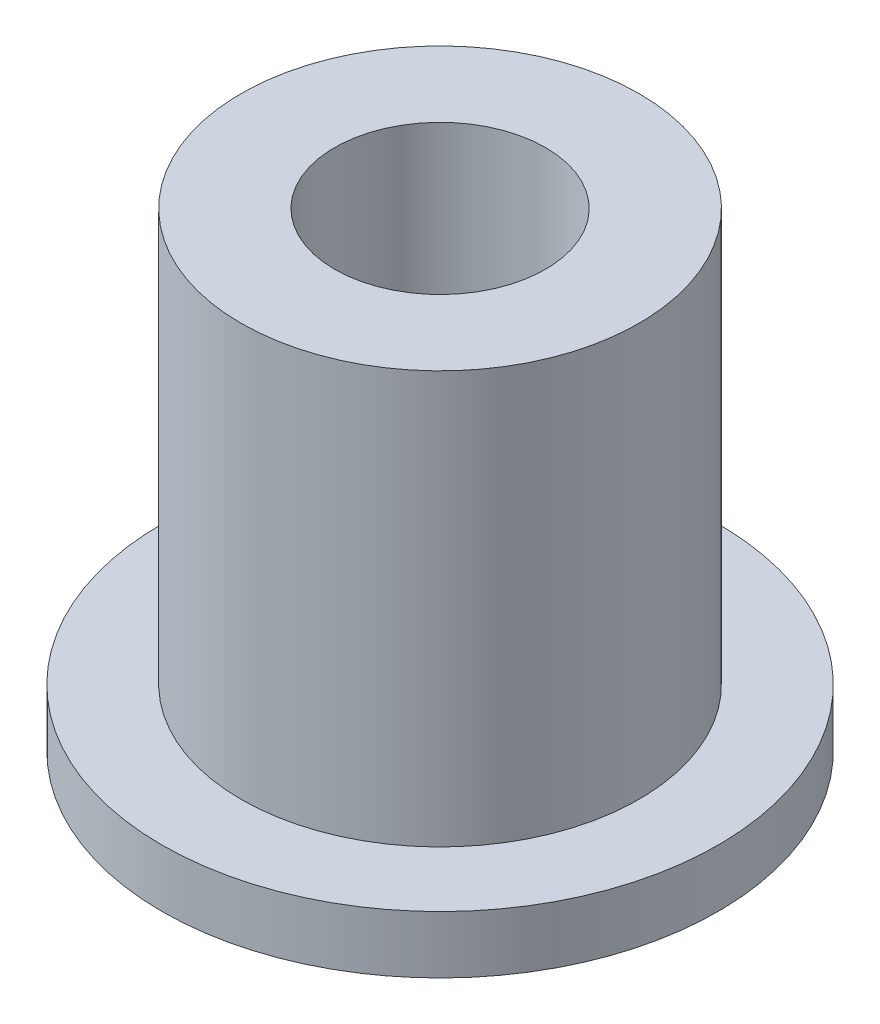
ISO-10303-21;
HEADER;
FILE_DESCRIPTION(('STEP AP214'),'2;1');
FILE_NAME('part.step','',(''),(''),'','','');
FILE_SCHEMA(('AUTOMOTIVE_DESIGN { 1 0 10303 214 1 1 1 1 }'));
ENDSEC;
DATA;
#1=APPLICATION_CONTEXT('core data for automotive mechanical design processes');
#2=APPLICATION_PROTOCOL_DEFINITION('international standard','automotive_design',2000,#1);
#3=PRODUCT_CONTEXT('',#1,'mechanical');
#4=PRODUCT('Part','Part','',(#3));
#5=PRODUCT_RELATED_PRODUCT_CATEGORY('part','',(#4));
#6=PRODUCT_DEFINITION_FORMATION('','',#4);
#7=PRODUCT_DEFINITION_CONTEXT('part definition',#1,'design');
#8=PRODUCT_DEFINITION('design','',#6,#7);
#9=PRODUCT_DEFINITION_SHAPE('','',#8);
#10=(LENGTH_UNIT() NAMED_UNIT(*) SI_UNIT(.MILLI.,.METRE.));
#11=(NAMED_UNIT(*) PLANE_ANGLE_UNIT() SI_UNIT($,.RADIAN.));
#12=(NAMED_UNIT(*) SI_UNIT($,.STERADIAN.) SOLID_ANGLE_UNIT());
#13=UNCERTAINTY_MEASURE_WITH_UNIT(LENGTH_MEASURE(1.E-05),#10,'distance_accuracy_value','');
#14=(GEOMETRIC_REPRESENTATION_CONTEXT(3) GLOBAL_UNCERTAINTY_ASSIGNED_CONTEXT((#13)) GLOBAL_UNIT_ASSIGNED_CONTEXT((#10,
#11,#12)) REPRESENTATION_CONTEXT('',''));
#15=CARTESIAN_POINT('',(0.,0.,0.));
#16=DIRECTION('',(0.,0.,1.));
#17=DIRECTION('',(1.,0.,0.));
#18=AXIS2_PLACEMENT_3D('',#15,#16,#17);
#19=CARTESIAN_POINT('',(0.,78.3,163.));
#20=DIRECTION('',(0.,1.,0.));
#21=DIRECTION('',(0.,0.,1.));
#22=AXIS2_PLACEMENT_3D('',#19,#20,#21);
#23=PLANE('',#22);
#24=CARTESIAN_POINT('',(0.,78.3,163.));
#25=DIRECTION('',(0.,1.,0.));
#26=DIRECTION('',(0.,0.,1.));
#27=AXIS2_PLACEMENT_3D('',#24,#25,#26);
#28=CIRCLE('',#27,2.2);
#29=CARTESIAN_POINT('',(0.,78.3,165.2));
#30=VERTEX_POINT('',#29);
#31=EDGE_CURVE('E17',#30,#30,#28,.T.);
#32=ORIENTED_EDGE('',*,*,#31,.T.);
#33=EDGE_LOOP('',(#32));
#34=FACE_BOUND('',#33,.T.);
#35=CARTESIAN_POINT('',(0.,78.3,163.));
#36=DIRECTION('',(0.,1.,0.));
#37=DIRECTION('',(0.,0.,1.));
#38=AXIS2_PLACEMENT_3D('',#35,#36,#37);
#39=CIRCLE('',#38,5.8);
#40=CARTESIAN_POINT('',(0.,78.3,168.8));
#41=VERTEX_POINT('',#40);
#42=EDGE_CURVE('E33',#41,#41,#39,.T.);
#43=ORIENTED_EDGE('',*,*,#42,.F.);
#44=EDGE_LOOP('',(#43));
#45=FACE_BOUND('',#44,.T.);
#46=ADVANCED_FACE('F14',(#34,#45),#23,.F.);
#47=CARTESIAN_POINT('',(0.,77.3,163.));
#48=DIRECTION('',(0.,1.,0.));
#49=DIRECTION('',(0.,0.,1.));
#50=AXIS2_PLACEMENT_3D('',#47,#48,#49);
#51=CYLINDRICAL_SURFACE('',#50,2.2);
#52=ORIENTED_EDGE('',*,*,#31,.F.);
#53=EDGE_LOOP('',(#52));
#54=FACE_BOUND('',#53,.T.);
#55=CARTESIAN_POINT('',(0.,88.1,163.));
#56=DIRECTION('',(0.,1.,0.));
#57=DIRECTION('',(0.,0.,1.));
#58=AXIS2_PLACEMENT_3D('',#55,#56,#57);
#59=CIRCLE('',#58,2.2);
#60=CARTESIAN_POINT('',(0.,88.1,165.2));
#61=VERTEX_POINT('',#60);
#62=EDGE_CURVE('E31',#61,#61,#59,.F.);
#63=ORIENTED_EDGE('',*,*,#62,.F.);
#64=EDGE_LOOP('',(#63));
#65=FACE_BOUND('',#64,.T.);
#66=ADVANCED_FACE('F42',(#54,#65),#51,.F.);
#67=CARTESIAN_POINT('',(0.,78.3,163.));
#68=DIRECTION('',(0.,1.,0.));
#69=DIRECTION('',(0.,0.,1.));
#70=AXIS2_PLACEMENT_3D('',#67,#68,#69);
#71=CYLINDRICAL_SURFACE('',#70,5.8);
#72=ORIENTED_EDGE('',*,*,#42,.T.);
#73=EDGE_LOOP('',(#72));
#74=FACE_BOUND('',#73,.T.);
#75=CARTESIAN_POINT('',(0.,79.5,163.));
#76=DIRECTION('',(0.,1.,0.));
#77=DIRECTION('',(0.,0.,1.));
#78=AXIS2_PLACEMENT_3D('',#75,#76,#77);
#79=CIRCLE('',#78,5.8);
#80=CARTESIAN_POINT('',(0.,79.5,168.8));
#81=VERTEX_POINT('',#80);
#82=EDGE_CURVE('E26',#81,#81,#79,.T.);
#83=ORIENTED_EDGE('',*,*,#82,.F.);
#84=EDGE_LOOP('',(#83));
#85=FACE_BOUND('',#84,.T.);
#86=ADVANCED_FACE('F45',(#74,#85),#71,.T.);
#87=CARTESIAN_POINT('',(0.,88.1,163.));
#88=DIRECTION('',(0.,1.,0.));
#89=DIRECTION('',(0.,0.,1.));
#90=AXIS2_PLACEMENT_3D('',#87,#88,#89);
#91=PLANE('',#90);
#92=ORIENTED_EDGE('',*,*,#62,.T.);
#93=EDGE_LOOP('',(#92));
#94=FACE_BOUND('',#93,.T.);
#95=CARTESIAN_POINT('',(0.,88.1,163.));
#96=DIRECTION('',(0.,1.,0.));
#97=DIRECTION('',(0.,0.,1.));
#98=AXIS2_PLACEMENT_3D('',#95,#96,#97);
#99=CIRCLE('',#98,4.15);
#100=CARTESIAN_POINT('',(0.,88.1,167.15));
#101=VERTEX_POINT('',#100);
#102=EDGE_CURVE('E21',#101,#101,#99,.F.);
#103=ORIENTED_EDGE('',*,*,#102,.F.);
#104=EDGE_LOOP('',(#103));
#105=FACE_BOUND('',#104,.T.);
#106=ADVANCED_FACE('F48',(#94,#105),#91,.T.);
#107=CARTESIAN_POINT('',(0.,79.5,163.));
#108=DIRECTION('',(0.,1.,0.));
#109=DIRECTION('',(0.,0.,1.));
#110=AXIS2_PLACEMENT_3D('',#107,#108,#109);
#111=PLANE('',#110);
#112=CARTESIAN_POINT('',(0.,79.5,163.));
#113=DIRECTION('',(0.,1.,0.));
#114=DIRECTION('',(0.,0.,1.));
#115=AXIS2_PLACEMENT_3D('',#112,#113,#114);
#116=CIRCLE('',#115,4.15);
#117=CARTESIAN_POINT('',(0.,79.5,167.15));
#118=VERTEX_POINT('',#117);
#119=EDGE_CURVE('E9',#118,#118,#116,.T.);
#120=ORIENTED_EDGE('',*,*,#119,.F.);
#121=EDGE_LOOP('',(#120));
#122=FACE_BOUND('',#121,.T.);
#123=ORIENTED_EDGE('',*,*,#82,.T.);
#124=EDGE_LOOP('',(#123));
#125=FACE_BOUND('',#124,.T.);
#126=ADVANCED_FACE('F51',(#122,#125),#111,.T.);
#127=CARTESIAN_POINT('',(0.,79.5,163.));
#128=DIRECTION('',(0.,1.,0.));
#129=DIRECTION('',(0.,0.,1.));
#130=AXIS2_PLACEMENT_3D('',#127,#128,#129);
#131=CYLINDRICAL_SURFACE('',#130,4.15);
#132=ORIENTED_EDGE('',*,*,#119,.T.);
#133=EDGE_LOOP('',(#132));
#134=FACE_BOUND('',#133,.T.);
#135=ORIENTED_EDGE('',*,*,#102,.T.);
#136=EDGE_LOOP('',(#135));
#137=FACE_BOUND('',#136,.T.);
#138=ADVANCED_FACE('F55',(#134,#137),#131,.T.);
#139=CLOSED_SHELL('',(#46,#66,#86,#106,#126,#138));
#140=MANIFOLD_SOLID_BREP('B1',#139);
#141=ADVANCED_BREP_SHAPE_REPRESENTATION('',(#18,#140),#14);
#142=SHAPE_DEFINITION_REPRESENTATION(#9,#141);
ENDSEC;
END-ISO-10303-21;
